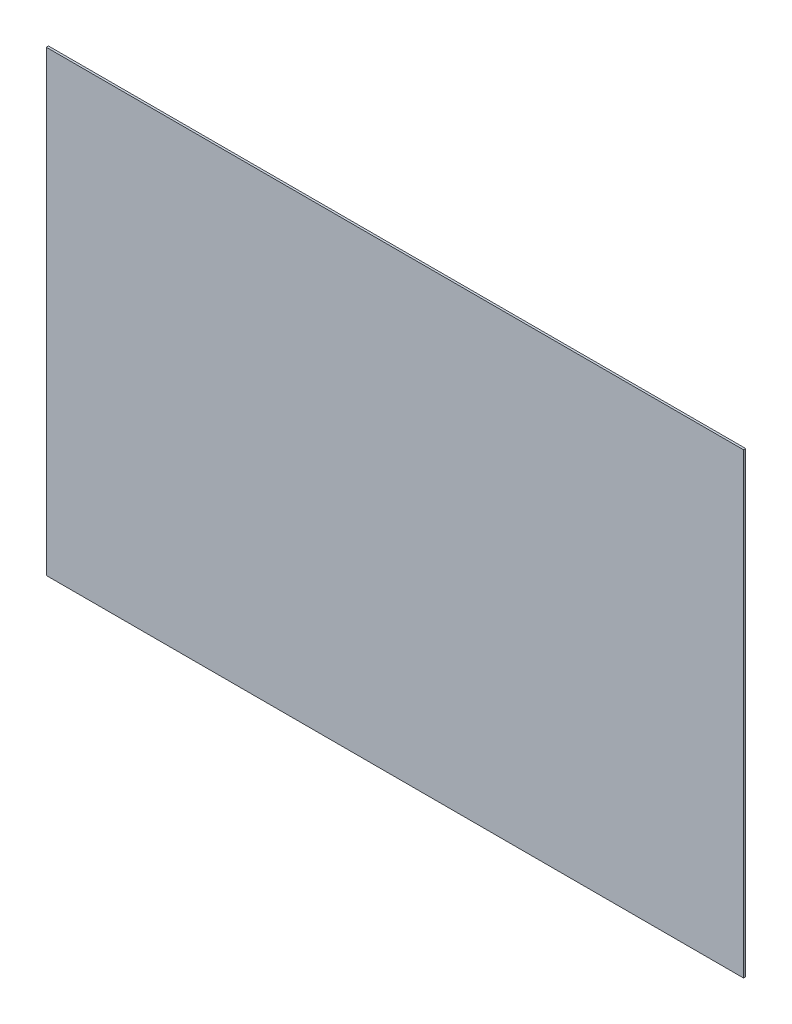
ISO-10303-21;
HEADER;
FILE_DESCRIPTION(('STEP AP214'),'2;1');
FILE_NAME('part.step','',(''),(''),'','','');
FILE_SCHEMA(('AUTOMOTIVE_DESIGN { 1 0 10303 214 1 1 1 1 }'));
ENDSEC;
DATA;
#1=APPLICATION_CONTEXT('core data for automotive mechanical design processes');
#2=APPLICATION_PROTOCOL_DEFINITION('international standard','automotive_design',2000,#1);
#3=PRODUCT_CONTEXT('',#1,'mechanical');
#4=PRODUCT('Part','Part','',(#3));
#5=PRODUCT_RELATED_PRODUCT_CATEGORY('part','',(#4));
#6=PRODUCT_DEFINITION_FORMATION('','',#4);
#7=PRODUCT_DEFINITION_CONTEXT('part definition',#1,'design');
#8=PRODUCT_DEFINITION('design','',#6,#7);
#9=PRODUCT_DEFINITION_SHAPE('','',#8);
#10=(LENGTH_UNIT() NAMED_UNIT(*) SI_UNIT(.MILLI.,.METRE.));
#11=(NAMED_UNIT(*) PLANE_ANGLE_UNIT() SI_UNIT($,.RADIAN.));
#12=(NAMED_UNIT(*) SI_UNIT($,.STERADIAN.) SOLID_ANGLE_UNIT());
#13=UNCERTAINTY_MEASURE_WITH_UNIT(LENGTH_MEASURE(1.E-05),#10,'distance_accuracy_value','');
#14=(GEOMETRIC_REPRESENTATION_CONTEXT(3) GLOBAL_UNCERTAINTY_ASSIGNED_CONTEXT((#13)) GLOBAL_UNIT_ASSIGNED_CONTEXT((#10,
#11,#12)) REPRESENTATION_CONTEXT('',''));
#15=CARTESIAN_POINT('',(0.,0.,0.));
#16=DIRECTION('',(0.,0.,1.));
#17=DIRECTION('',(1.,0.,0.));
#18=AXIS2_PLACEMENT_3D('',#15,#16,#17);
#19=CARTESIAN_POINT('',(0.,0.,1.));
#20=DIRECTION('',(-1.,0.,0.));
#21=DIRECTION('',(0.,-1.,0.));
#22=AXIS2_PLACEMENT_3D('',#19,#20,#21);
#23=PLANE('',#22);
#24=DIRECTION('',(0.,1.,0.));
#25=VECTOR('',#24,1.);
#26=CARTESIAN_POINT('',(0.,0.,0.));
#27=LINE('',#26,#25);
#28=CARTESIAN_POINT('',(0.,0.,0.));
#29=VERTEX_POINT('',#28);
#30=CARTESIAN_POINT('',(0.,210.,0.));
#31=VERTEX_POINT('',#30);
#32=EDGE_CURVE('E100',#29,#31,#27,.T.);
#33=ORIENTED_EDGE('',*,*,#32,.T.);
#34=DIRECTION('',(0.,0.,-1.));
#35=VECTOR('',#34,1.);
#36=CARTESIAN_POINT('',(0.,210.,1.));
#37=LINE('',#36,#35);
#38=CARTESIAN_POINT('',(0.,210.,1.));
#39=VERTEX_POINT('',#38);
#40=EDGE_CURVE('E11',#39,#31,#37,.T.);
#41=ORIENTED_EDGE('',*,*,#40,.F.);
#42=DIRECTION('',(0.,1.,0.));
#43=VECTOR('',#42,1.);
#44=CARTESIAN_POINT('',(0.,0.,1.));
#45=LINE('',#44,#43);
#46=CARTESIAN_POINT('',(0.,0.,1.));
#47=VERTEX_POINT('',#46);
#48=EDGE_CURVE('E88',#47,#39,#45,.T.);
#49=ORIENTED_EDGE('',*,*,#48,.F.);
#50=DIRECTION('',(0.,0.,-1.));
#51=VECTOR('',#50,1.);
#52=CARTESIAN_POINT('',(0.,0.,1.));
#53=LINE('',#52,#51);
#54=EDGE_CURVE('E96',#47,#29,#53,.T.);
#55=ORIENTED_EDGE('',*,*,#54,.T.);
#56=EDGE_LOOP('',(#33,#41,#49,#55));
#57=FACE_BOUND('',#56,.T.);
#58=ADVANCED_FACE('F37',(#57),#23,.F.);
#59=CARTESIAN_POINT('',(0.,210.,1.));
#60=DIRECTION('',(0.,-1.,0.));
#61=DIRECTION('',(1.,0.,0.));
#62=AXIS2_PLACEMENT_3D('',#59,#60,#61);
#63=PLANE('',#62);
#64=DIRECTION('',(-1.,0.,0.));
#65=VECTOR('',#64,1.);
#66=CARTESIAN_POINT('',(0.,210.,0.));
#67=LINE('',#66,#65);
#68=CARTESIAN_POINT('',(-320.,210.,0.));
#69=VERTEX_POINT('',#68);
#70=EDGE_CURVE('E92',#31,#69,#67,.T.);
#71=ORIENTED_EDGE('',*,*,#70,.T.);
#72=DIRECTION('',(0.,0.,-1.));
#73=VECTOR('',#72,1.);
#74=CARTESIAN_POINT('',(-320.,210.,1.));
#75=LINE('',#74,#73);
#76=CARTESIAN_POINT('',(-320.,210.,1.));
#77=VERTEX_POINT('',#76);
#78=EDGE_CURVE('E45',#77,#69,#75,.T.);
#79=ORIENTED_EDGE('',*,*,#78,.F.);
#80=DIRECTION('',(-1.,0.,0.));
#81=VECTOR('',#80,1.);
#82=CARTESIAN_POINT('',(0.,210.,1.));
#83=LINE('',#82,#81);
#84=EDGE_CURVE('E83',#39,#77,#83,.T.);
#85=ORIENTED_EDGE('',*,*,#84,.F.);
#86=ORIENTED_EDGE('',*,*,#40,.T.);
#87=EDGE_LOOP('',(#71,#79,#85,#86));
#88=FACE_BOUND('',#87,.T.);
#89=ADVANCED_FACE('F91',(#88),#63,.F.);
#90=CARTESIAN_POINT('',(-320.,0.,1.));
#91=DIRECTION('',(1.,0.,0.));
#92=DIRECTION('',(0.,0.,-1.));
#93=AXIS2_PLACEMENT_3D('',#90,#91,#92);
#94=PLANE('',#93);
#95=DIRECTION('',(0.,-1.,0.));
#96=VECTOR('',#95,1.);
#97=CARTESIAN_POINT('',(-320.,0.,0.));
#98=LINE('',#97,#96);
#99=CARTESIAN_POINT('',(-320.,0.,0.));
#100=VERTEX_POINT('',#99);
#101=EDGE_CURVE('E70',#69,#100,#98,.T.);
#102=ORIENTED_EDGE('',*,*,#101,.T.);
#103=DIRECTION('',(0.,0.,-1.));
#104=VECTOR('',#103,1.);
#105=CARTESIAN_POINT('',(-320.,0.,1.));
#106=LINE('',#105,#104);
#107=CARTESIAN_POINT('',(-320.,0.,1.));
#108=VERTEX_POINT('',#107);
#109=EDGE_CURVE('E93',#108,#100,#106,.T.);
#110=ORIENTED_EDGE('',*,*,#109,.F.);
#111=DIRECTION('',(0.,-1.,0.));
#112=VECTOR('',#111,1.);
#113=CARTESIAN_POINT('',(-320.,0.,1.));
#114=LINE('',#113,#112);
#115=EDGE_CURVE('E86',#77,#108,#114,.T.);
#116=ORIENTED_EDGE('',*,*,#115,.F.);
#117=ORIENTED_EDGE('',*,*,#78,.T.);
#118=EDGE_LOOP('',(#102,#110,#116,#117));
#119=FACE_BOUND('',#118,.T.);
#120=ADVANCED_FACE('F94',(#119),#94,.F.);
#121=CARTESIAN_POINT('',(0.,0.,1.));
#122=DIRECTION('',(0.,1.,0.));
#123=DIRECTION('',(0.,0.,1.));
#124=AXIS2_PLACEMENT_3D('',#121,#122,#123);
#125=PLANE('',#124);
#126=DIRECTION('',(1.,0.,0.));
#127=VECTOR('',#126,1.);
#128=CARTESIAN_POINT('',(0.,0.,0.));
#129=LINE('',#128,#127);
#130=EDGE_CURVE('E76',#100,#29,#129,.T.);
#131=ORIENTED_EDGE('',*,*,#130,.T.);
#132=ORIENTED_EDGE('',*,*,#54,.F.);
#133=DIRECTION('',(1.,0.,0.));
#134=VECTOR('',#133,1.);
#135=CARTESIAN_POINT('',(0.,0.,1.));
#136=LINE('',#135,#134);
#137=EDGE_CURVE('E53',#108,#47,#136,.T.);
#138=ORIENTED_EDGE('',*,*,#137,.F.);
#139=ORIENTED_EDGE('',*,*,#109,.T.);
#140=EDGE_LOOP('',(#131,#132,#138,#139));
#141=FACE_BOUND('',#140,.T.);
#142=ADVANCED_FACE('F107',(#141),#125,.F.);
#143=CARTESIAN_POINT('',(0.,0.,1.));
#144=DIRECTION('',(0.,0.,1.));
#145=DIRECTION('',(1.,0.,0.));
#146=AXIS2_PLACEMENT_3D('',#143,#144,#145);
#147=PLANE('',#146);
#148=ORIENTED_EDGE('',*,*,#48,.T.);
#149=ORIENTED_EDGE('',*,*,#84,.T.);
#150=ORIENTED_EDGE('',*,*,#115,.T.);
#151=ORIENTED_EDGE('',*,*,#137,.T.);
#152=EDGE_LOOP('',(#148,#149,#150,#151));
#153=FACE_BOUND('',#152,.T.);
#154=ADVANCED_FACE('F84',(#153),#147,.T.);
#155=CARTESIAN_POINT('',(0.,0.,0.));
#156=DIRECTION('',(0.,0.,1.));
#157=DIRECTION('',(1.,0.,0.));
#158=AXIS2_PLACEMENT_3D('',#155,#156,#157);
#159=PLANE('',#158);
#160=ORIENTED_EDGE('',*,*,#32,.F.);
#161=ORIENTED_EDGE('',*,*,#130,.F.);
#162=ORIENTED_EDGE('',*,*,#101,.F.);
#163=ORIENTED_EDGE('',*,*,#70,.F.);
#164=EDGE_LOOP('',(#160,#161,#162,#163));
#165=FACE_BOUND('',#164,.T.);
#166=ADVANCED_FACE('F110',(#165),#159,.F.);
#167=CLOSED_SHELL('',(#58,#89,#120,#142,#154,#166));
#168=MANIFOLD_SOLID_BREP('B2',#167);
#169=ADVANCED_BREP_SHAPE_REPRESENTATION('',(#18,#168),#14);
#170=SHAPE_DEFINITION_REPRESENTATION(#9,#169);
ENDSEC;
END-ISO-10303-21;
